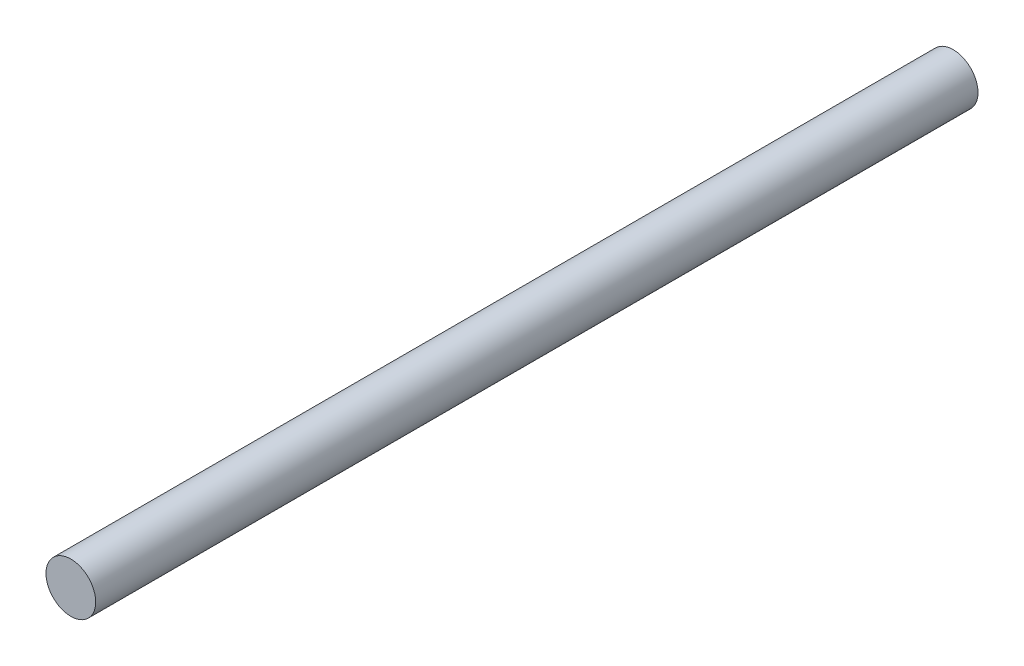
ISO-10303-21;
HEADER;
FILE_DESCRIPTION(('STEP AP214'),'2;1');
FILE_NAME('part.step','',(''),(''),'','','');
FILE_SCHEMA(('AUTOMOTIVE_DESIGN { 1 0 10303 214 1 1 1 1 }'));
ENDSEC;
DATA;
#1=APPLICATION_CONTEXT('core data for automotive mechanical design processes');
#2=APPLICATION_PROTOCOL_DEFINITION('international standard','automotive_design',2000,#1);
#3=PRODUCT_CONTEXT('',#1,'mechanical');
#4=PRODUCT('Part','Part','',(#3));
#5=PRODUCT_RELATED_PRODUCT_CATEGORY('part','',(#4));
#6=PRODUCT_DEFINITION_FORMATION('','',#4);
#7=PRODUCT_DEFINITION_CONTEXT('part definition',#1,'design');
#8=PRODUCT_DEFINITION('design','',#6,#7);
#9=PRODUCT_DEFINITION_SHAPE('','',#8);
#10=(LENGTH_UNIT() NAMED_UNIT(*) SI_UNIT(.MILLI.,.METRE.));
#11=(NAMED_UNIT(*) PLANE_ANGLE_UNIT() SI_UNIT($,.RADIAN.));
#12=(NAMED_UNIT(*) SI_UNIT($,.STERADIAN.) SOLID_ANGLE_UNIT());
#13=UNCERTAINTY_MEASURE_WITH_UNIT(LENGTH_MEASURE(1.E-05),#10,'distance_accuracy_value','');
#14=(GEOMETRIC_REPRESENTATION_CONTEXT(3) GLOBAL_UNCERTAINTY_ASSIGNED_CONTEXT((#13)) GLOBAL_UNIT_ASSIGNED_CONTEXT((#10,
#11,#12)) REPRESENTATION_CONTEXT('',''));
#15=CARTESIAN_POINT('',(0.,0.,0.));
#16=DIRECTION('',(0.,0.,1.));
#17=DIRECTION('',(1.,0.,0.));
#18=AXIS2_PLACEMENT_3D('',#15,#16,#17);
#19=CARTESIAN_POINT('',(0.,0.,0.));
#20=DIRECTION('',(0.,0.,1.));
#21=DIRECTION('',(1.,0.,0.));
#22=AXIS2_PLACEMENT_3D('',#19,#20,#21);
#23=CYLINDRICAL_SURFACE('',#22,19.05);
#24=CARTESIAN_POINT('',(0.,0.,676.402));
#25=DIRECTION('',(0.,0.,-1.));
#26=DIRECTION('',(0.,-1.,0.));
#27=AXIS2_PLACEMENT_3D('',#24,#25,#26);
#28=CIRCLE('',#27,19.05);
#29=CARTESIAN_POINT('',(0.,-19.05,676.402));
#30=VERTEX_POINT('',#29);
#31=EDGE_CURVE('E9',#30,#30,#28,.T.);
#32=ORIENTED_EDGE('',*,*,#31,.T.);
#33=EDGE_LOOP('',(#32));
#34=FACE_BOUND('',#33,.T.);
#35=CARTESIAN_POINT('',(0.,0.,0.));
#36=DIRECTION('',(0.,0.,-1.));
#37=DIRECTION('',(0.,-1.,0.));
#38=AXIS2_PLACEMENT_3D('',#35,#36,#37);
#39=CIRCLE('',#38,19.05);
#40=CARTESIAN_POINT('',(0.,-19.05,0.));
#41=VERTEX_POINT('',#40);
#42=EDGE_CURVE('E17',#41,#41,#39,.T.);
#43=ORIENTED_EDGE('',*,*,#42,.F.);
#44=EDGE_LOOP('',(#43));
#45=FACE_BOUND('',#44,.T.);
#46=ADVANCED_FACE('F14',(#34,#45),#23,.T.);
#47=CARTESIAN_POINT('',(0.,0.,0.));
#48=DIRECTION('',(0.,0.,1.));
#49=DIRECTION('',(1.,0.,0.));
#50=AXIS2_PLACEMENT_3D('',#47,#48,#49);
#51=PLANE('',#50);
#52=ORIENTED_EDGE('',*,*,#42,.T.);
#53=EDGE_LOOP('',(#52));
#54=FACE_BOUND('',#53,.T.);
#55=ADVANCED_FACE('F26',(#54),#51,.F.);
#56=CARTESIAN_POINT('',(0.,0.,676.402));
#57=DIRECTION('',(0.,0.,1.));
#58=DIRECTION('',(1.,0.,0.));
#59=AXIS2_PLACEMENT_3D('',#56,#57,#58);
#60=PLANE('',#59);
#61=ORIENTED_EDGE('',*,*,#31,.F.);
#62=EDGE_LOOP('',(#61));
#63=FACE_BOUND('',#62,.T.);
#64=ADVANCED_FACE('F33',(#63),#60,.T.);
#65=CLOSED_SHELL('',(#46,#55,#64));
#66=MANIFOLD_SOLID_BREP('B1',#65);
#67=ADVANCED_BREP_SHAPE_REPRESENTATION('',(#18,#66),#14);
#68=SHAPE_DEFINITION_REPRESENTATION(#9,#67);
ENDSEC;
END-ISO-10303-21;
